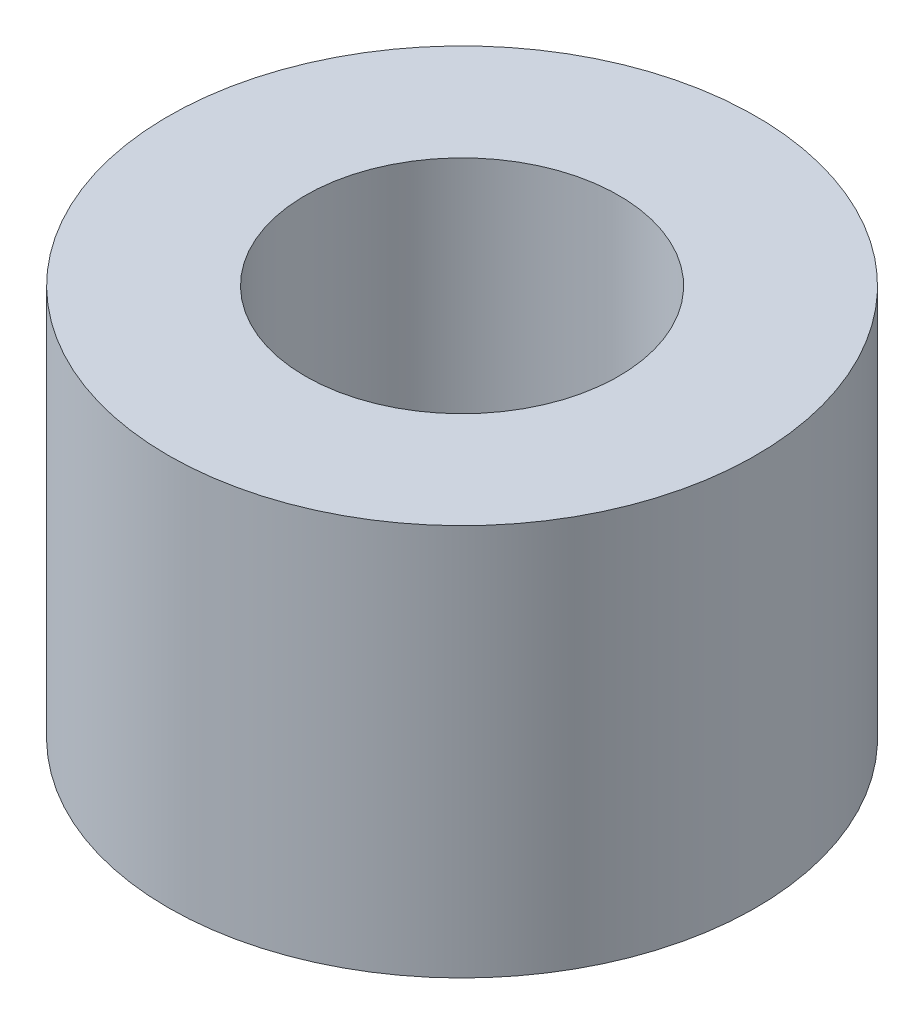
ISO-10303-21;
HEADER;
FILE_DESCRIPTION(('STEP AP214'),'2;1');
FILE_NAME('part.step','',(''),(''),'','','');
FILE_SCHEMA(('AUTOMOTIVE_DESIGN { 1 0 10303 214 1 1 1 1 }'));
ENDSEC;
DATA;
#1=APPLICATION_CONTEXT('core data for automotive mechanical design processes');
#2=APPLICATION_PROTOCOL_DEFINITION('international standard','automotive_design',2000,#1);
#3=PRODUCT_CONTEXT('',#1,'mechanical');
#4=PRODUCT('Part','Part','',(#3));
#5=PRODUCT_RELATED_PRODUCT_CATEGORY('part','',(#4));
#6=PRODUCT_DEFINITION_FORMATION('','',#4);
#7=PRODUCT_DEFINITION_CONTEXT('part definition',#1,'design');
#8=PRODUCT_DEFINITION('design','',#6,#7);
#9=PRODUCT_DEFINITION_SHAPE('','',#8);
#10=(LENGTH_UNIT() NAMED_UNIT(*) SI_UNIT(.MILLI.,.METRE.));
#11=(NAMED_UNIT(*) PLANE_ANGLE_UNIT() SI_UNIT($,.RADIAN.));
#12=(NAMED_UNIT(*) SI_UNIT($,.STERADIAN.) SOLID_ANGLE_UNIT());
#13=UNCERTAINTY_MEASURE_WITH_UNIT(LENGTH_MEASURE(1.E-05),#10,'distance_accuracy_value','');
#14=(GEOMETRIC_REPRESENTATION_CONTEXT(3) GLOBAL_UNCERTAINTY_ASSIGNED_CONTEXT((#13)) GLOBAL_UNIT_ASSIGNED_CONTEXT((#10,
#11,#12)) REPRESENTATION_CONTEXT('',''));
#15=CARTESIAN_POINT('',(0.,0.,0.));
#16=DIRECTION('',(0.,0.,1.));
#17=DIRECTION('',(1.,0.,0.));
#18=AXIS2_PLACEMENT_3D('',#15,#16,#17);
#19=CARTESIAN_POINT('',(0.,4.,0.));
#20=DIRECTION('',(0.,1.,0.));
#21=DIRECTION('',(0.,0.,1.));
#22=AXIS2_PLACEMENT_3D('',#19,#20,#21);
#23=PLANE('',#22);
#24=CARTESIAN_POINT('',(0.,4.,0.));
#25=DIRECTION('',(0.,1.,0.));
#26=DIRECTION('',(0.,0.,1.));
#27=AXIS2_PLACEMENT_3D('',#24,#25,#26);
#28=CIRCLE('',#27,3.);
#29=CARTESIAN_POINT('',(0.,4.,3.));
#30=VERTEX_POINT('',#29);
#31=EDGE_CURVE('E10',#30,#30,#28,.T.);
#32=ORIENTED_EDGE('',*,*,#31,.T.);
#33=EDGE_LOOP('',(#32));
#34=FACE_BOUND('',#33,.T.);
#35=CARTESIAN_POINT('',(0.,4.,0.));
#36=DIRECTION('',(0.,1.,0.));
#37=DIRECTION('',(0.,0.,1.));
#38=AXIS2_PLACEMENT_3D('',#35,#36,#37);
#39=CIRCLE('',#38,1.6);
#40=CARTESIAN_POINT('',(0.,4.,1.6));
#41=VERTEX_POINT('',#40);
#42=EDGE_CURVE('E52',#41,#41,#39,.T.);
#43=ORIENTED_EDGE('',*,*,#42,.F.);
#44=EDGE_LOOP('',(#43));
#45=FACE_BOUND('',#44,.T.);
#46=ADVANCED_FACE('F41',(#34,#45),#23,.T.);
#47=CARTESIAN_POINT('',(0.,0.,0.));
#48=DIRECTION('',(0.,1.,0.));
#49=DIRECTION('',(0.,0.,1.));
#50=AXIS2_PLACEMENT_3D('',#47,#48,#49);
#51=PLANE('',#50);
#52=CARTESIAN_POINT('',(0.,0.,0.));
#53=DIRECTION('',(0.,1.,0.));
#54=DIRECTION('',(0.,0.,1.));
#55=AXIS2_PLACEMENT_3D('',#52,#53,#54);
#56=CIRCLE('',#55,3.);
#57=CARTESIAN_POINT('',(0.,0.,3.));
#58=VERTEX_POINT('',#57);
#59=EDGE_CURVE('E45',#58,#58,#56,.T.);
#60=ORIENTED_EDGE('',*,*,#59,.F.);
#61=EDGE_LOOP('',(#60));
#62=FACE_BOUND('',#61,.T.);
#63=CARTESIAN_POINT('',(0.,0.,0.));
#64=DIRECTION('',(0.,1.,0.));
#65=DIRECTION('',(0.,0.,1.));
#66=AXIS2_PLACEMENT_3D('',#63,#64,#65);
#67=CIRCLE('',#66,1.6);
#68=CARTESIAN_POINT('',(0.,0.,1.6));
#69=VERTEX_POINT('',#68);
#70=EDGE_CURVE('E54',#69,#69,#67,.T.);
#71=ORIENTED_EDGE('',*,*,#70,.T.);
#72=EDGE_LOOP('',(#71));
#73=FACE_BOUND('',#72,.T.);
#74=ADVANCED_FACE('F64',(#62,#73),#51,.F.);
#75=CARTESIAN_POINT('',(0.,4.,0.));
#76=DIRECTION('',(0.,-1.,0.));
#77=DIRECTION('',(0.,0.,-1.));
#78=AXIS2_PLACEMENT_3D('',#75,#76,#77);
#79=CYLINDRICAL_SURFACE('',#78,3.);
#80=ORIENTED_EDGE('',*,*,#31,.F.);
#81=EDGE_LOOP('',(#80));
#82=FACE_BOUND('',#81,.T.);
#83=ORIENTED_EDGE('',*,*,#59,.T.);
#84=EDGE_LOOP('',(#83));
#85=FACE_BOUND('',#84,.T.);
#86=ADVANCED_FACE('F43',(#82,#85),#79,.T.);
#87=CARTESIAN_POINT('',(0.,4.,0.));
#88=DIRECTION('',(0.,-1.,0.));
#89=DIRECTION('',(0.,0.,-1.));
#90=AXIS2_PLACEMENT_3D('',#87,#88,#89);
#91=CYLINDRICAL_SURFACE('',#90,1.6);
#92=ORIENTED_EDGE('',*,*,#42,.T.);
#93=EDGE_LOOP('',(#92));
#94=FACE_BOUND('',#93,.T.);
#95=ORIENTED_EDGE('',*,*,#70,.F.);
#96=EDGE_LOOP('',(#95));
#97=FACE_BOUND('',#96,.T.);
#98=ADVANCED_FACE('F60',(#94,#97),#91,.F.);
#99=CLOSED_SHELL('',(#46,#74,#86,#98));
#100=MANIFOLD_SOLID_BREP('B2',#99);
#101=ADVANCED_BREP_SHAPE_REPRESENTATION('',(#18,#100),#14);
#102=SHAPE_DEFINITION_REPRESENTATION(#9,#101);
ENDSEC;
END-ISO-10303-21;
